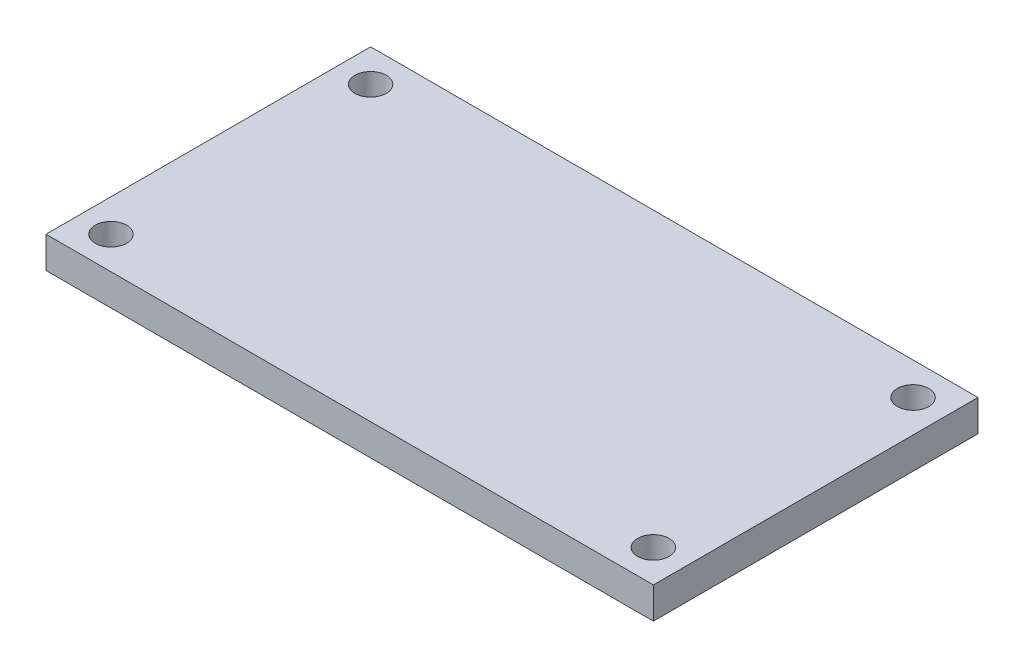
ISO-10303-21;
HEADER;
FILE_DESCRIPTION(('STEP AP214'),'2;1');
FILE_NAME('part.step','',(''),(''),'','','');
FILE_SCHEMA(('AUTOMOTIVE_DESIGN { 1 0 10303 214 1 1 1 1 }'));
ENDSEC;
DATA;
#1=APPLICATION_CONTEXT('core data for automotive mechanical design processes');
#2=APPLICATION_PROTOCOL_DEFINITION('international standard','automotive_design',2000,#1);
#3=PRODUCT_CONTEXT('',#1,'mechanical');
#4=PRODUCT('Part','Part','',(#3));
#5=PRODUCT_RELATED_PRODUCT_CATEGORY('part','',(#4));
#6=PRODUCT_DEFINITION_FORMATION('','',#4);
#7=PRODUCT_DEFINITION_CONTEXT('part definition',#1,'design');
#8=PRODUCT_DEFINITION('design','',#6,#7);
#9=PRODUCT_DEFINITION_SHAPE('','',#8);
#10=(LENGTH_UNIT() NAMED_UNIT(*) SI_UNIT(.MILLI.,.METRE.));
#11=(NAMED_UNIT(*) PLANE_ANGLE_UNIT() SI_UNIT($,.RADIAN.));
#12=(NAMED_UNIT(*) SI_UNIT($,.STERADIAN.) SOLID_ANGLE_UNIT());
#13=UNCERTAINTY_MEASURE_WITH_UNIT(LENGTH_MEASURE(1.E-05),#10,'distance_accuracy_value','');
#14=(GEOMETRIC_REPRESENTATION_CONTEXT(3) GLOBAL_UNCERTAINTY_ASSIGNED_CONTEXT((#13)) GLOBAL_UNIT_ASSIGNED_CONTEXT((#10,
#11,#12)) REPRESENTATION_CONTEXT('',''));
#15=CARTESIAN_POINT('',(0.,0.,0.));
#16=DIRECTION('',(0.,0.,1.));
#17=DIRECTION('',(1.,0.,0.));
#18=AXIS2_PLACEMENT_3D('',#15,#16,#17);
#19=CARTESIAN_POINT('',(29.,3.,-15.5));
#20=DIRECTION('',(-1.,0.,0.));
#21=DIRECTION('',(0.,0.,1.));
#22=AXIS2_PLACEMENT_3D('',#19,#20,#21);
#23=PLANE('',#22);
#24=DIRECTION('',(0.,0.,-1.));
#25=VECTOR('',#24,1.);
#26=CARTESIAN_POINT('',(29.,0.,-15.5));
#27=LINE('',#26,#25);
#28=CARTESIAN_POINT('',(29.,0.,15.5));
#29=VERTEX_POINT('',#28);
#30=CARTESIAN_POINT('',(29.,0.,-15.5));
#31=VERTEX_POINT('',#30);
#32=EDGE_CURVE('E107',#29,#31,#27,.T.);
#33=ORIENTED_EDGE('',*,*,#32,.T.);
#34=DIRECTION('',(0.,-1.,0.));
#35=VECTOR('',#34,1.);
#36=CARTESIAN_POINT('',(29.,3.,-15.5));
#37=LINE('',#36,#35);
#38=CARTESIAN_POINT('',(29.,3.,-15.5));
#39=VERTEX_POINT('',#38);
#40=EDGE_CURVE('E11',#39,#31,#37,.T.);
#41=ORIENTED_EDGE('',*,*,#40,.F.);
#42=DIRECTION('',(0.,0.,-1.));
#43=VECTOR('',#42,1.);
#44=CARTESIAN_POINT('',(29.,3.,-15.5));
#45=LINE('',#44,#43);
#46=CARTESIAN_POINT('',(29.,3.,15.5));
#47=VERTEX_POINT('',#46);
#48=EDGE_CURVE('E91',#47,#39,#45,.T.);
#49=ORIENTED_EDGE('',*,*,#48,.F.);
#50=DIRECTION('',(0.,-1.,0.));
#51=VECTOR('',#50,1.);
#52=CARTESIAN_POINT('',(29.,3.,15.5));
#53=LINE('',#52,#51);
#54=EDGE_CURVE('E103',#47,#29,#53,.T.);
#55=ORIENTED_EDGE('',*,*,#54,.T.);
#56=EDGE_LOOP('',(#33,#41,#49,#55));
#57=FACE_BOUND('',#56,.T.);
#58=ADVANCED_FACE('F39',(#57),#23,.F.);
#59=CARTESIAN_POINT('',(-29.,3.,-15.5));
#60=DIRECTION('',(0.,0.,1.));
#61=DIRECTION('',(1.,0.,0.));
#62=AXIS2_PLACEMENT_3D('',#59,#60,#61);
#63=PLANE('',#62);
#64=DIRECTION('',(-1.,0.,0.));
#65=VECTOR('',#64,1.);
#66=CARTESIAN_POINT('',(-29.,0.,-15.5));
#67=LINE('',#66,#65);
#68=CARTESIAN_POINT('',(-29.,0.,-15.5));
#69=VERTEX_POINT('',#68);
#70=EDGE_CURVE('E96',#31,#69,#67,.T.);
#71=ORIENTED_EDGE('',*,*,#70,.T.);
#72=DIRECTION('',(0.,-1.,0.));
#73=VECTOR('',#72,1.);
#74=CARTESIAN_POINT('',(-29.,3.,-15.5));
#75=LINE('',#74,#73);
#76=CARTESIAN_POINT('',(-29.,3.,-15.5));
#77=VERTEX_POINT('',#76);
#78=EDGE_CURVE('E48',#77,#69,#75,.T.);
#79=ORIENTED_EDGE('',*,*,#78,.F.);
#80=DIRECTION('',(-1.,0.,0.));
#81=VECTOR('',#80,1.);
#82=CARTESIAN_POINT('',(-29.,3.,-15.5));
#83=LINE('',#82,#81);
#84=EDGE_CURVE('E86',#39,#77,#83,.T.);
#85=ORIENTED_EDGE('',*,*,#84,.F.);
#86=ORIENTED_EDGE('',*,*,#40,.T.);
#87=EDGE_LOOP('',(#71,#79,#85,#86));
#88=FACE_BOUND('',#87,.T.);
#89=ADVANCED_FACE('F95',(#88),#63,.F.);
#90=CARTESIAN_POINT('',(-29.,3.,-15.5));
#91=DIRECTION('',(1.,0.,0.));
#92=DIRECTION('',(0.,0.,-1.));
#93=AXIS2_PLACEMENT_3D('',#90,#91,#92);
#94=PLANE('',#93);
#95=DIRECTION('',(0.,0.,1.));
#96=VECTOR('',#95,1.);
#97=CARTESIAN_POINT('',(-29.,0.,-15.5));
#98=LINE('',#97,#96);
#99=CARTESIAN_POINT('',(-29.,0.,15.5));
#100=VERTEX_POINT('',#99);
#101=EDGE_CURVE('E73',#69,#100,#98,.T.);
#102=ORIENTED_EDGE('',*,*,#101,.T.);
#103=DIRECTION('',(0.,-1.,0.));
#104=VECTOR('',#103,1.);
#105=CARTESIAN_POINT('',(-29.,3.,15.5));
#106=LINE('',#105,#104);
#107=CARTESIAN_POINT('',(-29.,3.,15.5));
#108=VERTEX_POINT('',#107);
#109=EDGE_CURVE('E98',#108,#100,#106,.T.);
#110=ORIENTED_EDGE('',*,*,#109,.F.);
#111=DIRECTION('',(0.,0.,1.));
#112=VECTOR('',#111,1.);
#113=CARTESIAN_POINT('',(-29.,3.,-15.5));
#114=LINE('',#113,#112);
#115=EDGE_CURVE('E89',#77,#108,#114,.T.);
#116=ORIENTED_EDGE('',*,*,#115,.F.);
#117=ORIENTED_EDGE('',*,*,#78,.T.);
#118=EDGE_LOOP('',(#102,#110,#116,#117));
#119=FACE_BOUND('',#118,.T.);
#120=ADVANCED_FACE('F99',(#119),#94,.F.);
#121=CARTESIAN_POINT('',(-29.,3.,15.5));
#122=DIRECTION('',(0.,0.,-1.));
#123=DIRECTION('',(-1.,0.,0.));
#124=AXIS2_PLACEMENT_3D('',#121,#122,#123);
#125=PLANE('',#124);
#126=DIRECTION('',(1.,0.,0.));
#127=VECTOR('',#126,1.);
#128=CARTESIAN_POINT('',(-29.,0.,15.5));
#129=LINE('',#128,#127);
#130=EDGE_CURVE('E79',#100,#29,#129,.T.);
#131=ORIENTED_EDGE('',*,*,#130,.T.);
#132=ORIENTED_EDGE('',*,*,#54,.F.);
#133=DIRECTION('',(1.,0.,0.));
#134=VECTOR('',#133,1.);
#135=CARTESIAN_POINT('',(-29.,3.,15.5));
#136=LINE('',#135,#134);
#137=EDGE_CURVE('E56',#108,#47,#136,.T.);
#138=ORIENTED_EDGE('',*,*,#137,.F.);
#139=ORIENTED_EDGE('',*,*,#109,.T.);
#140=EDGE_LOOP('',(#131,#132,#138,#139));
#141=FACE_BOUND('',#140,.T.);
#142=ADVANCED_FACE('F121',(#141),#125,.F.);
#143=CARTESIAN_POINT('',(0.,3.,0.));
#144=DIRECTION('',(0.,1.,0.));
#145=DIRECTION('',(0.,0.,1.));
#146=AXIS2_PLACEMENT_3D('',#143,#144,#145);
#147=PLANE('',#146);
#148=CARTESIAN_POINT('',(25.9,3.,-12.4));
#149=DIRECTION('',(0.,-1.,0.));
#150=DIRECTION('',(0.,0.,1.));
#151=AXIS2_PLACEMENT_3D('',#148,#149,#150);
#152=CIRCLE('',#151,1.5);
#153=CARTESIAN_POINT('',(25.9,3.,-10.9));
#154=VERTEX_POINT('',#153);
#155=EDGE_CURVE('E152',#154,#154,#152,.T.);
#156=ORIENTED_EDGE('',*,*,#155,.T.);
#157=EDGE_LOOP('',(#156));
#158=FACE_BOUND('',#157,.T.);
#159=CARTESIAN_POINT('',(25.9,3.,12.4));
#160=DIRECTION('',(0.,1.,0.));
#161=DIRECTION('',(0.,0.,-1.));
#162=AXIS2_PLACEMENT_3D('',#159,#160,#161);
#163=CIRCLE('',#162,1.5);
#164=CARTESIAN_POINT('',(25.9,3.,10.9));
#165=VERTEX_POINT('',#164);
#166=EDGE_CURVE('E144',#165,#165,#163,.T.);
#167=ORIENTED_EDGE('',*,*,#166,.F.);
#168=EDGE_LOOP('',(#167));
#169=FACE_BOUND('',#168,.T.);
#170=CARTESIAN_POINT('',(-25.9,3.,12.4));
#171=DIRECTION('',(0.,-1.,0.));
#172=DIRECTION('',(0.,0.,-1.));
#173=AXIS2_PLACEMENT_3D('',#170,#171,#172);
#174=CIRCLE('',#173,1.5);
#175=CARTESIAN_POINT('',(-25.9,3.,10.9));
#176=VERTEX_POINT('',#175);
#177=EDGE_CURVE('E136',#176,#176,#174,.T.);
#178=ORIENTED_EDGE('',*,*,#177,.T.);
#179=EDGE_LOOP('',(#178));
#180=FACE_BOUND('',#179,.T.);
#181=CARTESIAN_POINT('',(-25.9,3.,-12.4));
#182=DIRECTION('',(0.,1.,0.));
#183=DIRECTION('',(0.,0.,1.));
#184=AXIS2_PLACEMENT_3D('',#181,#182,#183);
#185=CIRCLE('',#184,1.5);
#186=CARTESIAN_POINT('',(-25.9,3.,-10.9));
#187=VERTEX_POINT('',#186);
#188=EDGE_CURVE('E128',#187,#187,#185,.T.);
#189=ORIENTED_EDGE('',*,*,#188,.F.);
#190=EDGE_LOOP('',(#189));
#191=FACE_BOUND('',#190,.T.);
#192=ORIENTED_EDGE('',*,*,#48,.T.);
#193=ORIENTED_EDGE('',*,*,#84,.T.);
#194=ORIENTED_EDGE('',*,*,#115,.T.);
#195=ORIENTED_EDGE('',*,*,#137,.T.);
#196=EDGE_LOOP('',(#192,#193,#194,#195));
#197=FACE_BOUND('',#196,.T.);
#198=ADVANCED_FACE('F87',(#158,#169,#180,#191,#197),#147,.T.);
#199=CARTESIAN_POINT('',(0.,0.,0.));
#200=DIRECTION('',(0.,1.,0.));
#201=DIRECTION('',(0.,0.,1.));
#202=AXIS2_PLACEMENT_3D('',#199,#200,#201);
#203=PLANE('',#202);
#204=CARTESIAN_POINT('',(25.9,0.,-12.4));
#205=DIRECTION('',(0.,-1.,0.));
#206=DIRECTION('',(0.,0.,1.));
#207=AXIS2_PLACEMENT_3D('',#204,#205,#206);
#208=CIRCLE('',#207,1.5);
#209=CARTESIAN_POINT('',(25.9,0.,-10.9));
#210=VERTEX_POINT('',#209);
#211=EDGE_CURVE('E148',#210,#210,#208,.T.);
#212=ORIENTED_EDGE('',*,*,#211,.F.);
#213=EDGE_LOOP('',(#212));
#214=FACE_BOUND('',#213,.T.);
#215=CARTESIAN_POINT('',(25.9,0.,12.4));
#216=DIRECTION('',(0.,1.,0.));
#217=DIRECTION('',(0.,0.,-1.));
#218=AXIS2_PLACEMENT_3D('',#215,#216,#217);
#219=CIRCLE('',#218,1.5);
#220=CARTESIAN_POINT('',(25.9,0.,10.9));
#221=VERTEX_POINT('',#220);
#222=EDGE_CURVE('E140',#221,#221,#219,.T.);
#223=ORIENTED_EDGE('',*,*,#222,.T.);
#224=EDGE_LOOP('',(#223));
#225=FACE_BOUND('',#224,.T.);
#226=CARTESIAN_POINT('',(-25.9,0.,12.4));
#227=DIRECTION('',(0.,-1.,0.));
#228=DIRECTION('',(0.,0.,-1.));
#229=AXIS2_PLACEMENT_3D('',#226,#227,#228);
#230=CIRCLE('',#229,1.5);
#231=CARTESIAN_POINT('',(-25.9,0.,10.9));
#232=VERTEX_POINT('',#231);
#233=EDGE_CURVE('E132',#232,#232,#230,.T.);
#234=ORIENTED_EDGE('',*,*,#233,.F.);
#235=EDGE_LOOP('',(#234));
#236=FACE_BOUND('',#235,.T.);
#237=CARTESIAN_POINT('',(-25.9,0.,-12.4));
#238=DIRECTION('',(0.,1.,0.));
#239=DIRECTION('',(0.,0.,1.));
#240=AXIS2_PLACEMENT_3D('',#237,#238,#239);
#241=CIRCLE('',#240,1.5);
#242=CARTESIAN_POINT('',(-25.9,0.,-10.9));
#243=VERTEX_POINT('',#242);
#244=EDGE_CURVE('E111',#243,#243,#241,.T.);
#245=ORIENTED_EDGE('',*,*,#244,.T.);
#246=EDGE_LOOP('',(#245));
#247=FACE_BOUND('',#246,.T.);
#248=ORIENTED_EDGE('',*,*,#32,.F.);
#249=ORIENTED_EDGE('',*,*,#130,.F.);
#250=ORIENTED_EDGE('',*,*,#101,.F.);
#251=ORIENTED_EDGE('',*,*,#70,.F.);
#252=EDGE_LOOP('',(#248,#249,#250,#251));
#253=FACE_BOUND('',#252,.T.);
#254=ADVANCED_FACE('F124',(#214,#225,#236,#247,#253),#203,.F.);
#255=CARTESIAN_POINT('',(-25.9,0.,-12.4));
#256=DIRECTION('',(0.,1.,0.));
#257=DIRECTION('',(0.,0.,1.));
#258=AXIS2_PLACEMENT_3D('',#255,#256,#257);
#259=CYLINDRICAL_SURFACE('',#258,1.5);
#260=ORIENTED_EDGE('',*,*,#244,.F.);
#261=EDGE_LOOP('',(#260));
#262=FACE_BOUND('',#261,.T.);
#263=ORIENTED_EDGE('',*,*,#188,.T.);
#264=EDGE_LOOP('',(#263));
#265=FACE_BOUND('',#264,.T.);
#266=ADVANCED_FACE('F165',(#262,#265),#259,.F.);
#267=CARTESIAN_POINT('',(-25.9,0.,12.4));
#268=DIRECTION('',(0.,1.,0.));
#269=DIRECTION('',(0.,0.,1.));
#270=AXIS2_PLACEMENT_3D('',#267,#268,#269);
#271=CYLINDRICAL_SURFACE('',#270,1.5);
#272=ORIENTED_EDGE('',*,*,#233,.T.);
#273=EDGE_LOOP('',(#272));
#274=FACE_BOUND('',#273,.T.);
#275=ORIENTED_EDGE('',*,*,#177,.F.);
#276=EDGE_LOOP('',(#275));
#277=FACE_BOUND('',#276,.T.);
#278=ADVANCED_FACE('F175',(#274,#277),#271,.F.);
#279=CARTESIAN_POINT('',(25.9,0.,12.4));
#280=DIRECTION('',(0.,1.,0.));
#281=DIRECTION('',(0.,0.,1.));
#282=AXIS2_PLACEMENT_3D('',#279,#280,#281);
#283=CYLINDRICAL_SURFACE('',#282,1.5);
#284=ORIENTED_EDGE('',*,*,#222,.F.);
#285=EDGE_LOOP('',(#284));
#286=FACE_BOUND('',#285,.T.);
#287=ORIENTED_EDGE('',*,*,#166,.T.);
#288=EDGE_LOOP('',(#287));
#289=FACE_BOUND('',#288,.T.);
#290=ADVANCED_FACE('F217',(#286,#289),#283,.F.);
#291=CARTESIAN_POINT('',(25.9,0.,-12.4));
#292=DIRECTION('',(0.,1.,0.));
#293=DIRECTION('',(0.,0.,1.));
#294=AXIS2_PLACEMENT_3D('',#291,#292,#293);
#295=CYLINDRICAL_SURFACE('',#294,1.5);
#296=ORIENTED_EDGE('',*,*,#211,.T.);
#297=EDGE_LOOP('',(#296));
#298=FACE_BOUND('',#297,.T.);
#299=ORIENTED_EDGE('',*,*,#155,.F.);
#300=EDGE_LOOP('',(#299));
#301=FACE_BOUND('',#300,.T.);
#302=ADVANCED_FACE('F160',(#298,#301),#295,.F.);
#303=CLOSED_SHELL('',(#58,#89,#120,#142,#198,#254,#266,#278,#290,#302));
#304=MANIFOLD_SOLID_BREP('B2',#303);
#305=ADVANCED_BREP_SHAPE_REPRESENTATION('',(#18,#304),#14);
#306=SHAPE_DEFINITION_REPRESENTATION(#9,#305);
ENDSEC;
END-ISO-10303-21;
